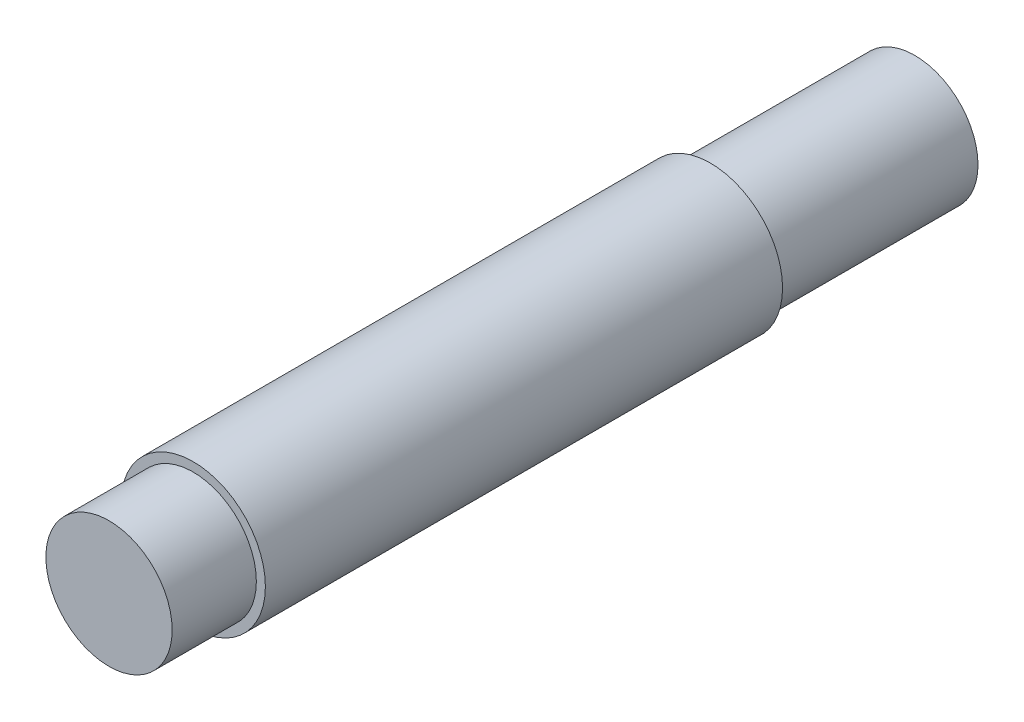
ISO-10303-21;
HEADER;
FILE_DESCRIPTION(('STEP AP214'),'2;1');
FILE_NAME('part.step','',(''),(''),'','','');
FILE_SCHEMA(('AUTOMOTIVE_DESIGN { 1 0 10303 214 1 1 1 1 }'));
ENDSEC;
DATA;
#1=APPLICATION_CONTEXT('core data for automotive mechanical design processes');
#2=APPLICATION_PROTOCOL_DEFINITION('international standard','automotive_design',2000,#1);
#3=PRODUCT_CONTEXT('',#1,'mechanical');
#4=PRODUCT('Part','Part','',(#3));
#5=PRODUCT_RELATED_PRODUCT_CATEGORY('part','',(#4));
#6=PRODUCT_DEFINITION_FORMATION('','',#4);
#7=PRODUCT_DEFINITION_CONTEXT('part definition',#1,'design');
#8=PRODUCT_DEFINITION('design','',#6,#7);
#9=PRODUCT_DEFINITION_SHAPE('','',#8);
#10=(LENGTH_UNIT() NAMED_UNIT(*) SI_UNIT(.MILLI.,.METRE.));
#11=(NAMED_UNIT(*) PLANE_ANGLE_UNIT() SI_UNIT($,.RADIAN.));
#12=(NAMED_UNIT(*) SI_UNIT($,.STERADIAN.) SOLID_ANGLE_UNIT());
#13=UNCERTAINTY_MEASURE_WITH_UNIT(LENGTH_MEASURE(1.E-05),#10,'distance_accuracy_value','');
#14=(GEOMETRIC_REPRESENTATION_CONTEXT(3) GLOBAL_UNCERTAINTY_ASSIGNED_CONTEXT((#13)) GLOBAL_UNIT_ASSIGNED_CONTEXT((#10,
#11,#12)) REPRESENTATION_CONTEXT('',''));
#15=CARTESIAN_POINT('',(0.,0.,0.));
#16=DIRECTION('',(0.,0.,1.));
#17=DIRECTION('',(1.,0.,0.));
#18=AXIS2_PLACEMENT_3D('',#15,#16,#17);
#19=CARTESIAN_POINT('',(0.,5.25,7.));
#20=DIRECTION('',(0.,0.,-1.));
#21=DIRECTION('',(-1.,0.,0.));
#22=AXIS2_PLACEMENT_3D('',#19,#20,#21);
#23=PLANE('',#22);
#24=CARTESIAN_POINT('',(0.,0.,7.));
#25=DIRECTION('',(0.,0.,1.));
#26=DIRECTION('',(1.,0.,0.));
#27=AXIS2_PLACEMENT_3D('',#24,#25,#26);
#28=CIRCLE('',#27,5.25);
#29=CARTESIAN_POINT('',(5.25,0.,7.));
#30=VERTEX_POINT('',#29);
#31=EDGE_CURVE('E66',#30,#30,#28,.T.);
#32=ORIENTED_EDGE('',*,*,#31,.T.);
#33=EDGE_LOOP('',(#32));
#34=FACE_BOUND('',#33,.T.);
#35=ADVANCED_FACE('F39',(#34),#23,.F.);
#36=CARTESIAN_POINT('',(0.,0.,-60.));
#37=DIRECTION('',(0.,0.,1.));
#38=DIRECTION('',(1.,0.,0.));
#39=AXIS2_PLACEMENT_3D('',#36,#37,#38);
#40=PLANE('',#39);
#41=CARTESIAN_POINT('',(0.,0.,-60.));
#42=DIRECTION('',(0.,0.,1.));
#43=DIRECTION('',(1.,0.,0.));
#44=AXIS2_PLACEMENT_3D('',#41,#42,#43);
#45=CIRCLE('',#44,5.25000000000001);
#46=CARTESIAN_POINT('',(5.25000000000001,0.,-60.));
#47=VERTEX_POINT('',#46);
#48=EDGE_CURVE('E10',#47,#47,#45,.T.);
#49=ORIENTED_EDGE('',*,*,#48,.F.);
#50=EDGE_LOOP('',(#49));
#51=FACE_BOUND('',#50,.T.);
#52=ADVANCED_FACE('F97',(#51),#40,.F.);
#53=CARTESIAN_POINT('',(0.,0.,7.));
#54=DIRECTION('',(0.,0.,1.));
#55=DIRECTION('',(1.,0.,0.));
#56=AXIS2_PLACEMENT_3D('',#53,#54,#55);
#57=CYLINDRICAL_SURFACE('',#56,5.25000000000001);
#58=CARTESIAN_POINT('',(0.,0.,-43.));
#59=DIRECTION('',(0.,0.,1.));
#60=DIRECTION('',(1.,0.,0.));
#61=AXIS2_PLACEMENT_3D('',#58,#59,#60);
#62=CIRCLE('',#61,5.25000000000001);
#63=CARTESIAN_POINT('',(5.25000000000001,0.,-43.));
#64=VERTEX_POINT('',#63);
#65=EDGE_CURVE('E46',#64,#64,#62,.T.);
#66=ORIENTED_EDGE('',*,*,#65,.F.);
#67=EDGE_LOOP('',(#66));
#68=FACE_BOUND('',#67,.T.);
#69=ORIENTED_EDGE('',*,*,#48,.T.);
#70=EDGE_LOOP('',(#69));
#71=FACE_BOUND('',#70,.T.);
#72=ADVANCED_FACE('F92',(#68,#71),#57,.T.);
#73=CARTESIAN_POINT('',(0.,5.25000000000001,-43.));
#74=DIRECTION('',(0.,0.,1.));
#75=DIRECTION('',(1.,0.,0.));
#76=AXIS2_PLACEMENT_3D('',#73,#74,#75);
#77=PLANE('',#76);
#78=CARTESIAN_POINT('',(0.,0.,-43.));
#79=DIRECTION('',(0.,0.,1.));
#80=DIRECTION('',(1.,0.,0.));
#81=AXIS2_PLACEMENT_3D('',#78,#79,#80);
#82=CIRCLE('',#81,6.);
#83=CARTESIAN_POINT('',(6.,0.,-43.));
#84=VERTEX_POINT('',#83);
#85=EDGE_CURVE('E51',#84,#84,#82,.T.);
#86=ORIENTED_EDGE('',*,*,#85,.F.);
#87=EDGE_LOOP('',(#86));
#88=FACE_BOUND('',#87,.T.);
#89=ORIENTED_EDGE('',*,*,#65,.T.);
#90=EDGE_LOOP('',(#89));
#91=FACE_BOUND('',#90,.T.);
#92=ADVANCED_FACE('F87',(#88,#91),#77,.F.);
#93=CARTESIAN_POINT('',(0.,0.,7.));
#94=DIRECTION('',(0.,0.,1.));
#95=DIRECTION('',(1.,0.,0.));
#96=AXIS2_PLACEMENT_3D('',#93,#94,#95);
#97=CYLINDRICAL_SURFACE('',#96,6.);
#98=CARTESIAN_POINT('',(0.,0.,0.));
#99=DIRECTION('',(0.,0.,1.));
#100=DIRECTION('',(1.,0.,0.));
#101=AXIS2_PLACEMENT_3D('',#98,#99,#100);
#102=CIRCLE('',#101,5.99999999999999);
#103=CARTESIAN_POINT('',(5.99999999999999,0.,0.));
#104=VERTEX_POINT('',#103);
#105=EDGE_CURVE('E56',#104,#104,#102,.T.);
#106=ORIENTED_EDGE('',*,*,#105,.F.);
#107=EDGE_LOOP('',(#106));
#108=FACE_BOUND('',#107,.T.);
#109=ORIENTED_EDGE('',*,*,#85,.T.);
#110=EDGE_LOOP('',(#109));
#111=FACE_BOUND('',#110,.T.);
#112=ADVANCED_FACE('F81',(#108,#111),#97,.T.);
#113=CARTESIAN_POINT('',(0.,5.99999999999999,0.));
#114=DIRECTION('',(0.,0.,-1.));
#115=DIRECTION('',(-1.,0.,0.));
#116=AXIS2_PLACEMENT_3D('',#113,#114,#115);
#117=PLANE('',#116);
#118=CARTESIAN_POINT('',(0.,0.,0.));
#119=DIRECTION('',(0.,0.,1.));
#120=DIRECTION('',(1.,0.,0.));
#121=AXIS2_PLACEMENT_3D('',#118,#119,#120);
#122=CIRCLE('',#121,5.25);
#123=CARTESIAN_POINT('',(5.25,0.,0.));
#124=VERTEX_POINT('',#123);
#125=EDGE_CURVE('E62',#124,#124,#122,.T.);
#126=ORIENTED_EDGE('',*,*,#125,.F.);
#127=EDGE_LOOP('',(#126));
#128=FACE_BOUND('',#127,.T.);
#129=ORIENTED_EDGE('',*,*,#105,.T.);
#130=EDGE_LOOP('',(#129));
#131=FACE_BOUND('',#130,.T.);
#132=ADVANCED_FACE('F75',(#128,#131),#117,.F.);
#133=CARTESIAN_POINT('',(0.,0.,7.));
#134=DIRECTION('',(0.,0.,1.));
#135=DIRECTION('',(1.,0.,0.));
#136=AXIS2_PLACEMENT_3D('',#133,#134,#135);
#137=CYLINDRICAL_SURFACE('',#136,5.25);
#138=ORIENTED_EDGE('',*,*,#31,.F.);
#139=EDGE_LOOP('',(#138));
#140=FACE_BOUND('',#139,.T.);
#141=ORIENTED_EDGE('',*,*,#125,.T.);
#142=EDGE_LOOP('',(#141));
#143=FACE_BOUND('',#142,.T.);
#144=ADVANCED_FACE('F72',(#140,#143),#137,.T.);
#145=CLOSED_SHELL('',(#35,#52,#72,#92,#112,#132,#144));
#146=MANIFOLD_SOLID_BREP('B2',#145);
#147=ADVANCED_BREP_SHAPE_REPRESENTATION('',(#18,#146),#14);
#148=SHAPE_DEFINITION_REPRESENTATION(#9,#147);
ENDSEC;
END-ISO-10303-21;
